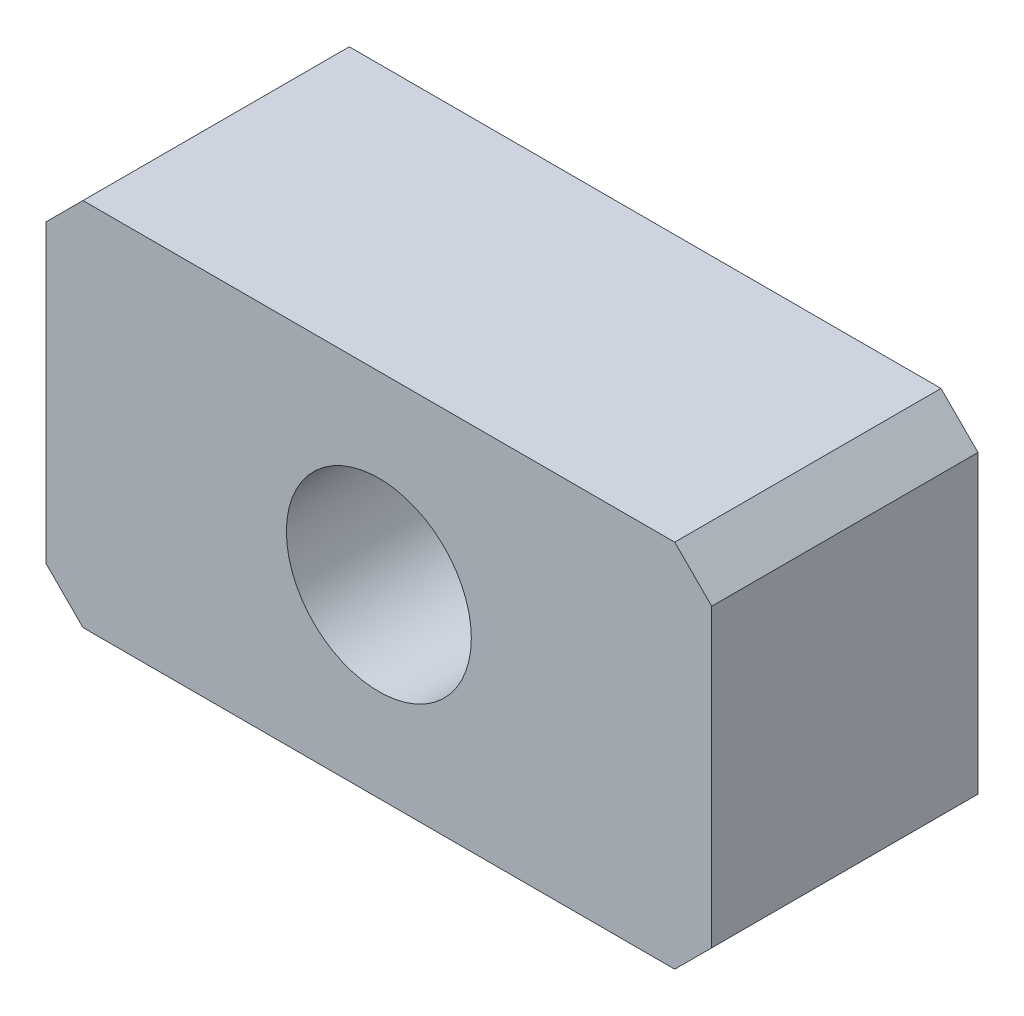
ISO-10303-21;
HEADER;
FILE_DESCRIPTION(('STEP AP214'),'2;1');
FILE_NAME('part.step','',(''),(''),'','','');
FILE_SCHEMA(('AUTOMOTIVE_DESIGN { 1 0 10303 214 1 1 1 1 }'));
ENDSEC;
DATA;
#1=APPLICATION_CONTEXT('core data for automotive mechanical design processes');
#2=APPLICATION_PROTOCOL_DEFINITION('international standard','automotive_design',2000,#1);
#3=PRODUCT_CONTEXT('',#1,'mechanical');
#4=PRODUCT('Part','Part','',(#3));
#5=PRODUCT_RELATED_PRODUCT_CATEGORY('part','',(#4));
#6=PRODUCT_DEFINITION_FORMATION('','',#4);
#7=PRODUCT_DEFINITION_CONTEXT('part definition',#1,'design');
#8=PRODUCT_DEFINITION('design','',#6,#7);
#9=PRODUCT_DEFINITION_SHAPE('','',#8);
#10=(LENGTH_UNIT() NAMED_UNIT(*) SI_UNIT(.MILLI.,.METRE.));
#11=(NAMED_UNIT(*) PLANE_ANGLE_UNIT() SI_UNIT($,.RADIAN.));
#12=(NAMED_UNIT(*) SI_UNIT($,.STERADIAN.) SOLID_ANGLE_UNIT());
#13=UNCERTAINTY_MEASURE_WITH_UNIT(LENGTH_MEASURE(1.E-05),#10,'distance_accuracy_value','');
#14=(GEOMETRIC_REPRESENTATION_CONTEXT(3) GLOBAL_UNCERTAINTY_ASSIGNED_CONTEXT((#13)) GLOBAL_UNIT_ASSIGNED_CONTEXT((#10,
#11,#12)) REPRESENTATION_CONTEXT('',''));
#15=CARTESIAN_POINT('',(0.,0.,0.));
#16=DIRECTION('',(0.,0.,1.));
#17=DIRECTION('',(1.,0.,0.));
#18=AXIS2_PLACEMENT_3D('',#15,#16,#17);
#19=CARTESIAN_POINT('',(0.,0.,7.2));
#20=DIRECTION('',(0.,0.,-1.));
#21=DIRECTION('',(-1.,0.,0.));
#22=AXIS2_PLACEMENT_3D('',#19,#20,#21);
#23=PLANE('',#22);
#24=DIRECTION('',(0.,-1.,0.));
#25=VECTOR('',#24,1.);
#26=CARTESIAN_POINT('',(-9.,-5.,7.2));
#27=LINE('',#26,#25);
#28=CARTESIAN_POINT('',(-9.,4.,7.2));
#29=VERTEX_POINT('',#28);
#30=CARTESIAN_POINT('',(-9.,-4.,7.2));
#31=VERTEX_POINT('',#30);
#32=EDGE_CURVE('E174',#29,#31,#27,.T.);
#33=ORIENTED_EDGE('',*,*,#32,.T.);
#34=DIRECTION('',(-0.707106781186547,0.707106781186548,0.));
#35=VECTOR('',#34,1.);
#36=CARTESIAN_POINT('',(-8.,-5.,7.2));
#37=LINE('',#36,#35);
#38=CARTESIAN_POINT('',(-8.,-5.,7.2));
#39=VERTEX_POINT('',#38);
#40=EDGE_CURVE('E151',#31,#39,#37,.F.);
#41=ORIENTED_EDGE('',*,*,#40,.T.);
#42=DIRECTION('',(1.,0.,0.));
#43=VECTOR('',#42,1.);
#44=CARTESIAN_POINT('',(-9.,-5.,7.2));
#45=LINE('',#44,#43);
#46=CARTESIAN_POINT('',(8.,-5.,7.2));
#47=VERTEX_POINT('',#46);
#48=EDGE_CURVE('E122',#39,#47,#45,.T.);
#49=ORIENTED_EDGE('',*,*,#48,.T.);
#50=DIRECTION('',(-0.707106781186548,-0.707106781186547,0.));
#51=VECTOR('',#50,1.);
#52=CARTESIAN_POINT('',(9.,-4.,7.2));
#53=LINE('',#52,#51);
#54=CARTESIAN_POINT('',(9.,-4.,7.2));
#55=VERTEX_POINT('',#54);
#56=EDGE_CURVE('E149',#47,#55,#53,.F.);
#57=ORIENTED_EDGE('',*,*,#56,.T.);
#58=DIRECTION('',(0.,1.,0.));
#59=VECTOR('',#58,1.);
#60=CARTESIAN_POINT('',(9.,-5.,7.2));
#61=LINE('',#60,#59);
#62=CARTESIAN_POINT('',(9.,4.,7.2));
#63=VERTEX_POINT('',#62);
#64=EDGE_CURVE('E129',#55,#63,#61,.T.);
#65=ORIENTED_EDGE('',*,*,#64,.T.);
#66=DIRECTION('',(0.707106781186547,-0.707106781186548,0.));
#67=VECTOR('',#66,1.);
#68=CARTESIAN_POINT('',(8.,5.,7.2));
#69=LINE('',#68,#67);
#70=CARTESIAN_POINT('',(8.,5.,7.2));
#71=VERTEX_POINT('',#70);
#72=EDGE_CURVE('E57',#63,#71,#69,.F.);
#73=ORIENTED_EDGE('',*,*,#72,.T.);
#74=DIRECTION('',(-1.,0.,0.));
#75=VECTOR('',#74,1.);
#76=CARTESIAN_POINT('',(-9.,5.,7.2));
#77=LINE('',#76,#75);
#78=CARTESIAN_POINT('',(-7.99999999999999,5.,7.2));
#79=VERTEX_POINT('',#78);
#80=EDGE_CURVE('E132',#71,#79,#77,.T.);
#81=ORIENTED_EDGE('',*,*,#80,.T.);
#82=DIRECTION('',(0.707106781186548,0.707106781186547,0.));
#83=VECTOR('',#82,1.);
#84=CARTESIAN_POINT('',(-9.,4.,7.2));
#85=LINE('',#84,#83);
#86=EDGE_CURVE('E146',#79,#29,#85,.F.);
#87=ORIENTED_EDGE('',*,*,#86,.T.);
#88=EDGE_LOOP('',(#33,#41,#49,#57,#65,#73,#81,#87));
#89=FACE_BOUND('',#88,.T.);
#90=CARTESIAN_POINT('',(0.,0.,7.2));
#91=DIRECTION('',(0.,0.,1.));
#92=DIRECTION('',(1.,0.,0.));
#93=AXIS2_PLACEMENT_3D('',#90,#91,#92);
#94=CIRCLE('',#93,2.5);
#95=CARTESIAN_POINT('',(2.5,0.,7.2));
#96=VERTEX_POINT('',#95);
#97=EDGE_CURVE('E167',#96,#96,#94,.T.);
#98=ORIENTED_EDGE('',*,*,#97,.F.);
#99=EDGE_LOOP('',(#98));
#100=FACE_BOUND('',#99,.T.);
#101=ADVANCED_FACE('F35',(#89,#100),#23,.F.);
#102=CARTESIAN_POINT('',(0.,0.,0.));
#103=DIRECTION('',(0.,0.,-1.));
#104=DIRECTION('',(-1.,0.,0.));
#105=AXIS2_PLACEMENT_3D('',#102,#103,#104);
#106=PLANE('',#105);
#107=DIRECTION('',(1.,0.,0.));
#108=VECTOR('',#107,1.);
#109=CARTESIAN_POINT('',(-9.,-5.,0.));
#110=LINE('',#109,#108);
#111=CARTESIAN_POINT('',(-8.,-5.,0.));
#112=VERTEX_POINT('',#111);
#113=CARTESIAN_POINT('',(8.,-5.,0.));
#114=VERTEX_POINT('',#113);
#115=EDGE_CURVE('E119',#112,#114,#110,.T.);
#116=ORIENTED_EDGE('',*,*,#115,.F.);
#117=DIRECTION('',(0.707106781186547,-0.707106781186548,0.));
#118=VECTOR('',#117,1.);
#119=CARTESIAN_POINT('',(-6.50000000000001,-6.49999999999999,0.));
#120=LINE('',#119,#118);
#121=CARTESIAN_POINT('',(-9.,-4.,0.));
#122=VERTEX_POINT('',#121);
#123=EDGE_CURVE('E102',#112,#122,#120,.F.);
#124=ORIENTED_EDGE('',*,*,#123,.T.);
#125=DIRECTION('',(0.,-1.,0.));
#126=VECTOR('',#125,1.);
#127=CARTESIAN_POINT('',(-9.,-5.,0.));
#128=LINE('',#127,#126);
#129=CARTESIAN_POINT('',(-9.,4.,0.));
#130=VERTEX_POINT('',#129);
#131=EDGE_CURVE('E130',#130,#122,#128,.T.);
#132=ORIENTED_EDGE('',*,*,#131,.F.);
#133=DIRECTION('',(-0.707106781186548,-0.707106781186547,0.));
#134=VECTOR('',#133,1.);
#135=CARTESIAN_POINT('',(-6.49999999999999,6.5,0.));
#136=LINE('',#135,#134);
#137=CARTESIAN_POINT('',(-7.99999999999999,5.,0.));
#138=VERTEX_POINT('',#137);
#139=EDGE_CURVE('E123',#130,#138,#136,.F.);
#140=ORIENTED_EDGE('',*,*,#139,.T.);
#141=DIRECTION('',(-1.,0.,0.));
#142=VECTOR('',#141,1.);
#143=CARTESIAN_POINT('',(-9.,5.,0.));
#144=LINE('',#143,#142);
#145=CARTESIAN_POINT('',(8.,5.,0.));
#146=VERTEX_POINT('',#145);
#147=EDGE_CURVE('E134',#146,#138,#144,.T.);
#148=ORIENTED_EDGE('',*,*,#147,.F.);
#149=DIRECTION('',(-0.707106781186547,0.707106781186548,0.));
#150=VECTOR('',#149,1.);
#151=CARTESIAN_POINT('',(6.50000000000001,6.5,0.));
#152=LINE('',#151,#150);
#153=CARTESIAN_POINT('',(9.,4.,0.));
#154=VERTEX_POINT('',#153);
#155=EDGE_CURVE('E140',#146,#154,#152,.F.);
#156=ORIENTED_EDGE('',*,*,#155,.T.);
#157=DIRECTION('',(0.,1.,0.));
#158=VECTOR('',#157,1.);
#159=CARTESIAN_POINT('',(9.,-5.,0.));
#160=LINE('',#159,#158);
#161=CARTESIAN_POINT('',(9.,-4.,0.));
#162=VERTEX_POINT('',#161);
#163=EDGE_CURVE('E162',#162,#154,#160,.T.);
#164=ORIENTED_EDGE('',*,*,#163,.F.);
#165=DIRECTION('',(0.707106781186548,0.707106781186547,0.));
#166=VECTOR('',#165,1.);
#167=CARTESIAN_POINT('',(6.49999999999999,-6.5,0.));
#168=LINE('',#167,#166);
#169=EDGE_CURVE('E113',#162,#114,#168,.F.);
#170=ORIENTED_EDGE('',*,*,#169,.T.);
#171=EDGE_LOOP('',(#116,#124,#132,#140,#148,#156,#164,#170));
#172=FACE_BOUND('',#171,.T.);
#173=CARTESIAN_POINT('',(0.,0.,0.));
#174=DIRECTION('',(0.,0.,1.));
#175=DIRECTION('',(1.,0.,0.));
#176=AXIS2_PLACEMENT_3D('',#173,#174,#175);
#177=CIRCLE('',#176,2.5);
#178=CARTESIAN_POINT('',(2.5,0.,0.));
#179=VERTEX_POINT('',#178);
#180=EDGE_CURVE('E170',#179,#179,#177,.T.);
#181=ORIENTED_EDGE('',*,*,#180,.T.);
#182=EDGE_LOOP('',(#181));
#183=FACE_BOUND('',#182,.T.);
#184=ADVANCED_FACE('F126',(#172,#183),#106,.T.);
#185=CARTESIAN_POINT('',(9.,-5.,7.2));
#186=DIRECTION('',(-1.,0.,0.));
#187=DIRECTION('',(0.,0.,1.));
#188=AXIS2_PLACEMENT_3D('',#185,#186,#187);
#189=PLANE('',#188);
#190=ORIENTED_EDGE('',*,*,#64,.F.);
#191=DIRECTION('',(0.,0.,-1.));
#192=VECTOR('',#191,1.);
#193=CARTESIAN_POINT('',(9.,-4.,7.2));
#194=LINE('',#193,#192);
#195=EDGE_CURVE('E155',#55,#162,#194,.T.);
#196=ORIENTED_EDGE('',*,*,#195,.T.);
#197=ORIENTED_EDGE('',*,*,#163,.T.);
#198=DIRECTION('',(0.,0.,1.));
#199=VECTOR('',#198,1.);
#200=CARTESIAN_POINT('',(9.,4.,7.2));
#201=LINE('',#200,#199);
#202=EDGE_CURVE('E153',#154,#63,#201,.T.);
#203=ORIENTED_EDGE('',*,*,#202,.T.);
#204=EDGE_LOOP('',(#190,#196,#197,#203));
#205=FACE_BOUND('',#204,.T.);
#206=ADVANCED_FACE('F161',(#205),#189,.F.);
#207=CARTESIAN_POINT('',(-9.,5.,7.2));
#208=DIRECTION('',(0.,-1.,0.));
#209=DIRECTION('',(0.,0.,-1.));
#210=AXIS2_PLACEMENT_3D('',#207,#208,#209);
#211=PLANE('',#210);
#212=ORIENTED_EDGE('',*,*,#80,.F.);
#213=DIRECTION('',(0.,0.,-1.));
#214=VECTOR('',#213,1.);
#215=CARTESIAN_POINT('',(8.,5.,7.2));
#216=LINE('',#215,#214);
#217=EDGE_CURVE('E11',#71,#146,#216,.T.);
#218=ORIENTED_EDGE('',*,*,#217,.T.);
#219=ORIENTED_EDGE('',*,*,#147,.T.);
#220=DIRECTION('',(0.,0.,1.));
#221=VECTOR('',#220,1.);
#222=CARTESIAN_POINT('',(-7.99999999999999,5.,7.2));
#223=LINE('',#222,#221);
#224=EDGE_CURVE('E44',#138,#79,#223,.T.);
#225=ORIENTED_EDGE('',*,*,#224,.T.);
#226=EDGE_LOOP('',(#212,#218,#219,#225));
#227=FACE_BOUND('',#226,.T.);
#228=ADVANCED_FACE('F203',(#227),#211,.F.);
#229=CARTESIAN_POINT('',(-9.,-5.,7.2));
#230=DIRECTION('',(1.,0.,0.));
#231=DIRECTION('',(0.,0.,-1.));
#232=AXIS2_PLACEMENT_3D('',#229,#230,#231);
#233=PLANE('',#232);
#234=ORIENTED_EDGE('',*,*,#131,.T.);
#235=DIRECTION('',(0.,0.,1.));
#236=VECTOR('',#235,1.);
#237=CARTESIAN_POINT('',(-9.,-4.,7.2));
#238=LINE('',#237,#236);
#239=EDGE_CURVE('E107',#122,#31,#238,.T.);
#240=ORIENTED_EDGE('',*,*,#239,.T.);
#241=ORIENTED_EDGE('',*,*,#32,.F.);
#242=DIRECTION('',(0.,0.,-1.));
#243=VECTOR('',#242,1.);
#244=CARTESIAN_POINT('',(-9.,4.,7.2));
#245=LINE('',#244,#243);
#246=EDGE_CURVE('E112',#29,#130,#245,.T.);
#247=ORIENTED_EDGE('',*,*,#246,.T.);
#248=EDGE_LOOP('',(#234,#240,#241,#247));
#249=FACE_BOUND('',#248,.T.);
#250=ADVANCED_FACE('F191',(#249),#233,.F.);
#251=CARTESIAN_POINT('',(-9.,-5.,7.2));
#252=DIRECTION('',(0.,1.,0.));
#253=DIRECTION('',(0.,0.,1.));
#254=AXIS2_PLACEMENT_3D('',#251,#252,#253);
#255=PLANE('',#254);
#256=ORIENTED_EDGE('',*,*,#48,.F.);
#257=DIRECTION('',(0.,0.,-1.));
#258=VECTOR('',#257,1.);
#259=CARTESIAN_POINT('',(-8.,-5.,7.2));
#260=LINE('',#259,#258);
#261=EDGE_CURVE('E106',#39,#112,#260,.T.);
#262=ORIENTED_EDGE('',*,*,#261,.T.);
#263=ORIENTED_EDGE('',*,*,#115,.T.);
#264=DIRECTION('',(0.,0.,1.));
#265=VECTOR('',#264,1.);
#266=CARTESIAN_POINT('',(8.,-5.,7.2));
#267=LINE('',#266,#265);
#268=EDGE_CURVE('E124',#114,#47,#267,.T.);
#269=ORIENTED_EDGE('',*,*,#268,.T.);
#270=EDGE_LOOP('',(#256,#262,#263,#269));
#271=FACE_BOUND('',#270,.T.);
#272=ADVANCED_FACE('F118',(#271),#255,.F.);
#273=CARTESIAN_POINT('',(0.,0.,7.2));
#274=DIRECTION('',(0.,0.,-1.));
#275=DIRECTION('',(-1.,0.,0.));
#276=AXIS2_PLACEMENT_3D('',#273,#274,#275);
#277=CYLINDRICAL_SURFACE('',#276,2.5);
#278=ORIENTED_EDGE('',*,*,#97,.T.);
#279=EDGE_LOOP('',(#278));
#280=FACE_BOUND('',#279,.T.);
#281=ORIENTED_EDGE('',*,*,#180,.F.);
#282=EDGE_LOOP('',(#281));
#283=FACE_BOUND('',#282,.T.);
#284=ADVANCED_FACE('F181',(#280,#283),#277,.F.);
#285=CARTESIAN_POINT('',(-8.,-5.,7.2));
#286=DIRECTION('',(0.707106781186548,0.707106781186547,0.));
#287=DIRECTION('',(0.,0.,-1.));
#288=AXIS2_PLACEMENT_3D('',#285,#286,#287);
#289=PLANE('',#288);
#290=ORIENTED_EDGE('',*,*,#40,.F.);
#291=ORIENTED_EDGE('',*,*,#239,.F.);
#292=ORIENTED_EDGE('',*,*,#123,.F.);
#293=ORIENTED_EDGE('',*,*,#261,.F.);
#294=EDGE_LOOP('',(#290,#291,#292,#293));
#295=FACE_BOUND('',#294,.T.);
#296=ADVANCED_FACE('F105',(#295),#289,.F.);
#297=CARTESIAN_POINT('',(9.,-4.,7.2));
#298=DIRECTION('',(-0.707106781186547,0.707106781186548,0.));
#299=DIRECTION('',(0.,0.,-1.));
#300=AXIS2_PLACEMENT_3D('',#297,#298,#299);
#301=PLANE('',#300);
#302=ORIENTED_EDGE('',*,*,#56,.F.);
#303=ORIENTED_EDGE('',*,*,#268,.F.);
#304=ORIENTED_EDGE('',*,*,#169,.F.);
#305=ORIENTED_EDGE('',*,*,#195,.F.);
#306=EDGE_LOOP('',(#302,#303,#304,#305));
#307=FACE_BOUND('',#306,.T.);
#308=ADVANCED_FACE('F189',(#307),#301,.F.);
#309=CARTESIAN_POINT('',(8.,5.,7.2));
#310=DIRECTION('',(-0.707106781186548,-0.707106781186547,0.));
#311=DIRECTION('',(0.,0.,-1.));
#312=AXIS2_PLACEMENT_3D('',#309,#310,#311);
#313=PLANE('',#312);
#314=ORIENTED_EDGE('',*,*,#72,.F.);
#315=ORIENTED_EDGE('',*,*,#202,.F.);
#316=ORIENTED_EDGE('',*,*,#155,.F.);
#317=ORIENTED_EDGE('',*,*,#217,.F.);
#318=EDGE_LOOP('',(#314,#315,#316,#317));
#319=FACE_BOUND('',#318,.T.);
#320=ADVANCED_FACE('F217',(#319),#313,.F.);
#321=CARTESIAN_POINT('',(-9.,4.,7.2));
#322=DIRECTION('',(0.707106781186547,-0.707106781186548,0.));
#323=DIRECTION('',(0.,0.,-1.));
#324=AXIS2_PLACEMENT_3D('',#321,#322,#323);
#325=PLANE('',#324);
#326=ORIENTED_EDGE('',*,*,#86,.F.);
#327=ORIENTED_EDGE('',*,*,#224,.F.);
#328=ORIENTED_EDGE('',*,*,#139,.F.);
#329=ORIENTED_EDGE('',*,*,#246,.F.);
#330=EDGE_LOOP('',(#326,#327,#328,#329));
#331=FACE_BOUND('',#330,.T.);
#332=ADVANCED_FACE('F38',(#331),#325,.F.);
#333=CLOSED_SHELL('',(#101,#184,#206,#228,#250,#272,#284,#296,#308,#320,#332));
#334=MANIFOLD_SOLID_BREP('B2',#333);
#335=ADVANCED_BREP_SHAPE_REPRESENTATION('',(#18,#334),#14);
#336=SHAPE_DEFINITION_REPRESENTATION(#9,#335);
ENDSEC;
END-ISO-10303-21;
